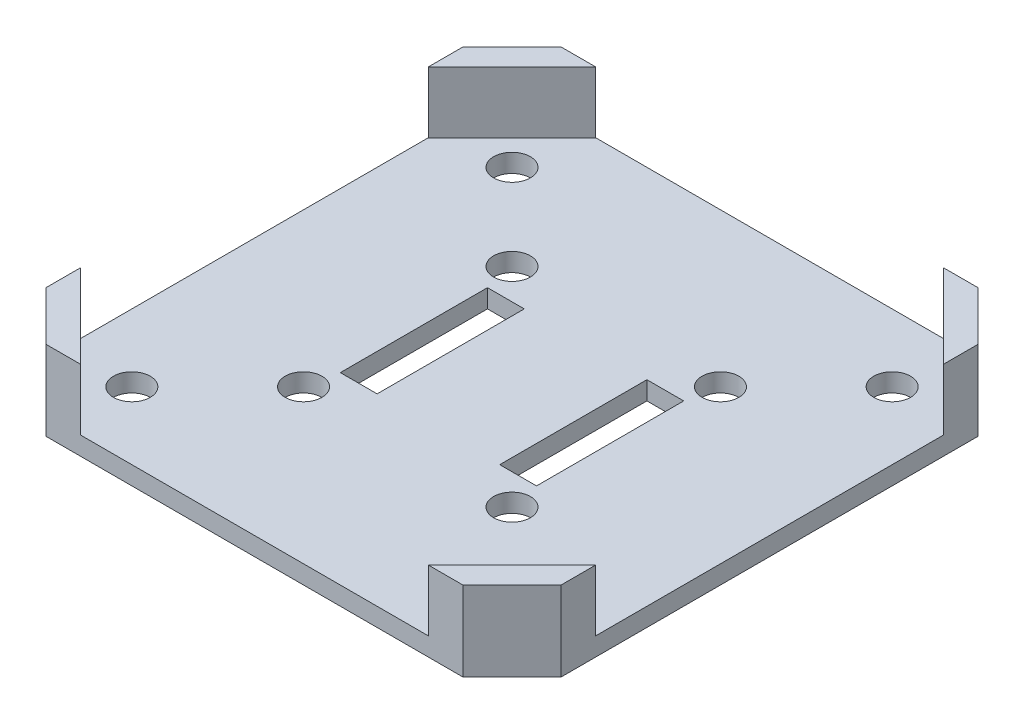
ISO-10303-21;
HEADER;
FILE_DESCRIPTION(('STEP AP214'),'2;1');
FILE_NAME('part.step','',(''),(''),'','','');
FILE_SCHEMA(('AUTOMOTIVE_DESIGN { 1 0 10303 214 1 1 1 1 }'));
ENDSEC;
DATA;
#1=APPLICATION_CONTEXT('core data for automotive mechanical design processes');
#2=APPLICATION_PROTOCOL_DEFINITION('international standard','automotive_design',2000,#1);
#3=PRODUCT_CONTEXT('',#1,'mechanical');
#4=PRODUCT('Part','Part','',(#3));
#5=PRODUCT_RELATED_PRODUCT_CATEGORY('part','',(#4));
#6=PRODUCT_DEFINITION_FORMATION('','',#4);
#7=PRODUCT_DEFINITION_CONTEXT('part definition',#1,'design');
#8=PRODUCT_DEFINITION('design','',#6,#7);
#9=PRODUCT_DEFINITION_SHAPE('','',#8);
#10=(LENGTH_UNIT() NAMED_UNIT(*) SI_UNIT(.MILLI.,.METRE.));
#11=(NAMED_UNIT(*) PLANE_ANGLE_UNIT() SI_UNIT($,.RADIAN.));
#12=(NAMED_UNIT(*) SI_UNIT($,.STERADIAN.) SOLID_ANGLE_UNIT());
#13=UNCERTAINTY_MEASURE_WITH_UNIT(LENGTH_MEASURE(1.E-05),#10,'distance_accuracy_value','');
#14=(GEOMETRIC_REPRESENTATION_CONTEXT(3) GLOBAL_UNCERTAINTY_ASSIGNED_CONTEXT((#13)) GLOBAL_UNIT_ASSIGNED_CONTEXT((#10,
#11,#12)) REPRESENTATION_CONTEXT('',''));
#15=CARTESIAN_POINT('',(0.,0.,0.));
#16=DIRECTION('',(0.,0.,1.));
#17=DIRECTION('',(1.,0.,0.));
#18=AXIS2_PLACEMENT_3D('',#15,#16,#17);
#19=CARTESIAN_POINT('',(0.,1.5,0.));
#20=DIRECTION('',(0.,-1.,0.));
#21=DIRECTION('',(0.,0.,-1.));
#22=AXIS2_PLACEMENT_3D('',#19,#20,#21);
#23=PLANE('',#22);
#24=DIRECTION('',(1.,0.,0.));
#25=VECTOR('',#24,1.);
#26=CARTESIAN_POINT('',(0.,1.5,-6.));
#27=LINE('',#26,#25);
#28=CARTESIAN_POINT('',(-8.,1.5,-6.));
#29=VERTEX_POINT('',#28);
#30=CARTESIAN_POINT('',(-5.,1.5,-6.));
#31=VERTEX_POINT('',#30);
#32=EDGE_CURVE('E338',#29,#31,#27,.T.);
#33=ORIENTED_EDGE('',*,*,#32,.T.);
#34=DIRECTION('',(0.,0.,1.));
#35=VECTOR('',#34,1.);
#36=CARTESIAN_POINT('',(-5.,1.5,0.));
#37=LINE('',#36,#35);
#38=CARTESIAN_POINT('',(-5.,1.5,6.));
#39=VERTEX_POINT('',#38);
#40=EDGE_CURVE('E341',#31,#39,#37,.T.);
#41=ORIENTED_EDGE('',*,*,#40,.T.);
#42=DIRECTION('',(-1.,0.,0.));
#43=VECTOR('',#42,1.);
#44=CARTESIAN_POINT('',(0.,1.5,6.));
#45=LINE('',#44,#43);
#46=CARTESIAN_POINT('',(-8.,1.5,6.));
#47=VERTEX_POINT('',#46);
#48=EDGE_CURVE('E332',#39,#47,#45,.T.);
#49=ORIENTED_EDGE('',*,*,#48,.T.);
#50=DIRECTION('',(0.,0.,-1.));
#51=VECTOR('',#50,1.);
#52=CARTESIAN_POINT('',(-8.,1.5,0.));
#53=LINE('',#52,#51);
#54=EDGE_CURVE('E335',#47,#29,#53,.T.);
#55=ORIENTED_EDGE('',*,*,#54,.T.);
#56=EDGE_LOOP('',(#33,#41,#49,#55));
#57=FACE_BOUND('',#56,.T.);
#58=DIRECTION('',(-1.,0.,0.));
#59=VECTOR('',#58,1.);
#60=CARTESIAN_POINT('',(0.,1.5,6.));
#61=LINE('',#60,#59);
#62=CARTESIAN_POINT('',(8.,1.5,6.));
#63=VERTEX_POINT('',#62);
#64=CARTESIAN_POINT('',(5.,1.5,6.));
#65=VERTEX_POINT('',#64);
#66=EDGE_CURVE('E326',#63,#65,#61,.T.);
#67=ORIENTED_EDGE('',*,*,#66,.T.);
#68=DIRECTION('',(0.,0.,-1.));
#69=VECTOR('',#68,1.);
#70=CARTESIAN_POINT('',(5.,1.5,0.));
#71=LINE('',#70,#69);
#72=CARTESIAN_POINT('',(5.,1.5,-6.));
#73=VERTEX_POINT('',#72);
#74=EDGE_CURVE('E329',#65,#73,#71,.T.);
#75=ORIENTED_EDGE('',*,*,#74,.T.);
#76=DIRECTION('',(1.,0.,0.));
#77=VECTOR('',#76,1.);
#78=CARTESIAN_POINT('',(0.,1.5,-6.));
#79=LINE('',#78,#77);
#80=CARTESIAN_POINT('',(8.,1.5,-6.));
#81=VERTEX_POINT('',#80);
#82=EDGE_CURVE('E296',#73,#81,#79,.T.);
#83=ORIENTED_EDGE('',*,*,#82,.T.);
#84=DIRECTION('',(0.,0.,1.));
#85=VECTOR('',#84,1.);
#86=CARTESIAN_POINT('',(8.,1.5,0.));
#87=LINE('',#86,#85);
#88=EDGE_CURVE('E323',#81,#63,#87,.T.);
#89=ORIENTED_EDGE('',*,*,#88,.T.);
#90=EDGE_LOOP('',(#67,#75,#83,#89));
#91=FACE_BOUND('',#90,.T.);
#92=CARTESIAN_POINT('',(-15.5,1.5,-15.5));
#93=DIRECTION('',(0.,1.,0.));
#94=DIRECTION('',(0.,0.,1.));
#95=AXIS2_PLACEMENT_3D('',#92,#93,#94);
#96=CIRCLE('',#95,1.5);
#97=CARTESIAN_POINT('',(-15.5,1.5,-14.));
#98=VERTEX_POINT('',#97);
#99=EDGE_CURVE('E387',#98,#98,#96,.T.);
#100=ORIENTED_EDGE('',*,*,#99,.F.);
#101=EDGE_LOOP('',(#100));
#102=FACE_BOUND('',#101,.T.);
#103=CARTESIAN_POINT('',(15.5,1.5,-15.5));
#104=DIRECTION('',(0.,1.,0.));
#105=DIRECTION('',(0.,0.,1.));
#106=AXIS2_PLACEMENT_3D('',#103,#104,#105);
#107=CIRCLE('',#106,1.5);
#108=CARTESIAN_POINT('',(15.5,1.5,-14.));
#109=VERTEX_POINT('',#108);
#110=EDGE_CURVE('E381',#109,#109,#107,.T.);
#111=ORIENTED_EDGE('',*,*,#110,.F.);
#112=EDGE_LOOP('',(#111));
#113=FACE_BOUND('',#112,.T.);
#114=CARTESIAN_POINT('',(15.5,1.5,15.5));
#115=DIRECTION('',(0.,1.,0.));
#116=DIRECTION('',(0.,0.,-1.));
#117=AXIS2_PLACEMENT_3D('',#114,#115,#116);
#118=CIRCLE('',#117,1.5);
#119=CARTESIAN_POINT('',(15.5,1.5,14.));
#120=VERTEX_POINT('',#119);
#121=EDGE_CURVE('E375',#120,#120,#118,.T.);
#122=ORIENTED_EDGE('',*,*,#121,.F.);
#123=EDGE_LOOP('',(#122));
#124=FACE_BOUND('',#123,.T.);
#125=CARTESIAN_POINT('',(-15.5,1.5,15.5));
#126=DIRECTION('',(0.,1.,0.));
#127=DIRECTION('',(0.,0.,-1.));
#128=AXIS2_PLACEMENT_3D('',#125,#126,#127);
#129=CIRCLE('',#128,1.5);
#130=CARTESIAN_POINT('',(-15.5,1.5,14.));
#131=VERTEX_POINT('',#130);
#132=EDGE_CURVE('E369',#131,#131,#129,.T.);
#133=ORIENTED_EDGE('',*,*,#132,.F.);
#134=EDGE_LOOP('',(#133));
#135=FACE_BOUND('',#134,.T.);
#136=CARTESIAN_POINT('',(-8.5,1.5,-8.5));
#137=DIRECTION('',(0.,1.,0.));
#138=DIRECTION('',(0.,0.,1.));
#139=AXIS2_PLACEMENT_3D('',#136,#137,#138);
#140=CIRCLE('',#139,1.5);
#141=CARTESIAN_POINT('',(-8.5,1.5,-7.));
#142=VERTEX_POINT('',#141);
#143=EDGE_CURVE('E363',#142,#142,#140,.T.);
#144=ORIENTED_EDGE('',*,*,#143,.F.);
#145=EDGE_LOOP('',(#144));
#146=FACE_BOUND('',#145,.T.);
#147=CARTESIAN_POINT('',(8.5,1.5,-8.5));
#148=DIRECTION('',(0.,1.,0.));
#149=DIRECTION('',(0.,0.,1.));
#150=AXIS2_PLACEMENT_3D('',#147,#148,#149);
#151=CIRCLE('',#150,1.5);
#152=CARTESIAN_POINT('',(8.5,1.5,-7.));
#153=VERTEX_POINT('',#152);
#154=EDGE_CURVE('E357',#153,#153,#151,.T.);
#155=ORIENTED_EDGE('',*,*,#154,.F.);
#156=EDGE_LOOP('',(#155));
#157=FACE_BOUND('',#156,.T.);
#158=CARTESIAN_POINT('',(8.5,1.5,8.5));
#159=DIRECTION('',(0.,1.,0.));
#160=DIRECTION('',(0.,0.,-1.));
#161=AXIS2_PLACEMENT_3D('',#158,#159,#160);
#162=CIRCLE('',#161,1.5);
#163=CARTESIAN_POINT('',(8.5,1.5,7.));
#164=VERTEX_POINT('',#163);
#165=EDGE_CURVE('E351',#164,#164,#162,.T.);
#166=ORIENTED_EDGE('',*,*,#165,.F.);
#167=EDGE_LOOP('',(#166));
#168=FACE_BOUND('',#167,.T.);
#169=CARTESIAN_POINT('',(-8.5,1.5,8.5));
#170=DIRECTION('',(0.,1.,0.));
#171=DIRECTION('',(0.,0.,-1.));
#172=AXIS2_PLACEMENT_3D('',#169,#170,#171);
#173=CIRCLE('',#172,1.5);
#174=CARTESIAN_POINT('',(-8.5,1.5,7.));
#175=VERTEX_POINT('',#174);
#176=EDGE_CURVE('E345',#175,#175,#173,.T.);
#177=ORIENTED_EDGE('',*,*,#176,.F.);
#178=EDGE_LOOP('',(#177));
#179=FACE_BOUND('',#178,.T.);
#180=DIRECTION('',(-0.707106781186548,0.,0.707106781186547));
#181=VECTOR('',#180,1.);
#182=CARTESIAN_POINT('',(17.5857864376269,1.5,17.5857864376269));
#183=LINE('',#182,#181);
#184=CARTESIAN_POINT('',(21.,1.5,14.1715728752538));
#185=VERTEX_POINT('',#184);
#186=CARTESIAN_POINT('',(14.1715728752538,1.5,21.));
#187=VERTEX_POINT('',#186);
#188=EDGE_CURVE('E215',#185,#187,#183,.T.);
#189=ORIENTED_EDGE('',*,*,#188,.F.);
#190=DIRECTION('',(0.,0.,-1.));
#191=VECTOR('',#190,1.);
#192=CARTESIAN_POINT('',(21.,1.5,11.5));
#193=LINE('',#192,#191);
#194=CARTESIAN_POINT('',(21.,1.5,-14.1715728752538));
#195=VERTEX_POINT('',#194);
#196=EDGE_CURVE('E219',#185,#195,#193,.T.);
#197=ORIENTED_EDGE('',*,*,#196,.T.);
#198=DIRECTION('',(-0.707106781186548,0.,-0.707106781186547));
#199=VECTOR('',#198,1.);
#200=CARTESIAN_POINT('',(17.5857864376269,1.5,-17.5857864376269));
#201=LINE('',#200,#199);
#202=CARTESIAN_POINT('',(14.1715728752538,1.5,-21.));
#203=VERTEX_POINT('',#202);
#204=EDGE_CURVE('E262',#195,#203,#201,.T.);
#205=ORIENTED_EDGE('',*,*,#204,.T.);
#206=DIRECTION('',(-1.,0.,0.));
#207=VECTOR('',#206,1.);
#208=CARTESIAN_POINT('',(-17.,1.5,-21.));
#209=LINE('',#208,#207);
#210=CARTESIAN_POINT('',(-14.1715728752538,1.5,-21.));
#211=VERTEX_POINT('',#210);
#212=EDGE_CURVE('E398',#203,#211,#209,.T.);
#213=ORIENTED_EDGE('',*,*,#212,.T.);
#214=DIRECTION('',(0.707106781186548,0.,-0.707106781186547));
#215=VECTOR('',#214,1.);
#216=CARTESIAN_POINT('',(-17.5857864376269,1.5,-17.5857864376269));
#217=LINE('',#216,#215);
#218=CARTESIAN_POINT('',(-21.,1.5,-14.1715728752538));
#219=VERTEX_POINT('',#218);
#220=EDGE_CURVE('E242',#219,#211,#217,.T.);
#221=ORIENTED_EDGE('',*,*,#220,.F.);
#222=DIRECTION('',(0.,0.,1.));
#223=VECTOR('',#222,1.);
#224=CARTESIAN_POINT('',(-21.,1.5,11.5));
#225=LINE('',#224,#223);
#226=CARTESIAN_POINT('',(-21.,1.5,14.1715728752538));
#227=VERTEX_POINT('',#226);
#228=EDGE_CURVE('E393',#219,#227,#225,.T.);
#229=ORIENTED_EDGE('',*,*,#228,.T.);
#230=DIRECTION('',(0.707106781186548,0.,0.707106781186547));
#231=VECTOR('',#230,1.);
#232=CARTESIAN_POINT('',(-17.5857864376269,1.5,17.5857864376269));
#233=LINE('',#232,#231);
#234=CARTESIAN_POINT('',(-14.1715728752538,1.5,21.));
#235=VERTEX_POINT('',#234);
#236=EDGE_CURVE('E55',#227,#235,#233,.T.);
#237=ORIENTED_EDGE('',*,*,#236,.T.);
#238=DIRECTION('',(1.,0.,0.));
#239=VECTOR('',#238,1.);
#240=CARTESIAN_POINT('',(17.,1.5,21.));
#241=LINE('',#240,#239);
#242=EDGE_CURVE('E50',#235,#187,#241,.T.);
#243=ORIENTED_EDGE('',*,*,#242,.T.);
#244=EDGE_LOOP('',(#189,#197,#205,#213,#221,#229,#237,#243));
#245=FACE_BOUND('',#244,.T.);
#246=ADVANCED_FACE('F35',(#57,#91,#102,#113,#124,#135,#146,#157,#168,#179,#245),#23,.F.);
#247=CARTESIAN_POINT('',(0.,0.,0.));
#248=DIRECTION('',(0.,-1.,0.));
#249=DIRECTION('',(0.,0.,-1.));
#250=AXIS2_PLACEMENT_3D('',#247,#248,#249);
#251=PLANE('',#250);
#252=DIRECTION('',(0.,0.,1.));
#253=VECTOR('',#252,1.);
#254=CARTESIAN_POINT('',(-5.,0.,-6.));
#255=LINE('',#254,#253);
#256=CARTESIAN_POINT('',(-5.,0.,-6.));
#257=VERTEX_POINT('',#256);
#258=CARTESIAN_POINT('',(-5.,0.,6.));
#259=VERTEX_POINT('',#258);
#260=EDGE_CURVE('E281',#257,#259,#255,.T.);
#261=ORIENTED_EDGE('',*,*,#260,.F.);
#262=DIRECTION('',(1.,0.,0.));
#263=VECTOR('',#262,1.);
#264=CARTESIAN_POINT('',(-5.,0.,-6.));
#265=LINE('',#264,#263);
#266=CARTESIAN_POINT('',(-8.,0.,-6.));
#267=VERTEX_POINT('',#266);
#268=EDGE_CURVE('E290',#267,#257,#265,.T.);
#269=ORIENTED_EDGE('',*,*,#268,.F.);
#270=DIRECTION('',(0.,0.,-1.));
#271=VECTOR('',#270,1.);
#272=CARTESIAN_POINT('',(-8.,0.,-6.));
#273=LINE('',#272,#271);
#274=CARTESIAN_POINT('',(-8.,0.,6.));
#275=VERTEX_POINT('',#274);
#276=EDGE_CURVE('E287',#275,#267,#273,.T.);
#277=ORIENTED_EDGE('',*,*,#276,.F.);
#278=DIRECTION('',(-1.,0.,0.));
#279=VECTOR('',#278,1.);
#280=CARTESIAN_POINT('',(-5.,0.,6.));
#281=LINE('',#280,#279);
#282=EDGE_CURVE('E283',#259,#275,#281,.T.);
#283=ORIENTED_EDGE('',*,*,#282,.F.);
#284=EDGE_LOOP('',(#261,#269,#277,#283));
#285=FACE_BOUND('',#284,.T.);
#286=DIRECTION('',(0.,0.,-1.));
#287=VECTOR('',#286,1.);
#288=CARTESIAN_POINT('',(5.,0.,-6.));
#289=LINE('',#288,#287);
#290=CARTESIAN_POINT('',(5.,0.,6.));
#291=VERTEX_POINT('',#290);
#292=CARTESIAN_POINT('',(5.,0.,-6.));
#293=VERTEX_POINT('',#292);
#294=EDGE_CURVE('E280',#291,#293,#289,.T.);
#295=ORIENTED_EDGE('',*,*,#294,.F.);
#296=DIRECTION('',(-1.,0.,0.));
#297=VECTOR('',#296,1.);
#298=CARTESIAN_POINT('',(5.,0.,6.));
#299=LINE('',#298,#297);
#300=CARTESIAN_POINT('',(8.,0.,6.));
#301=VERTEX_POINT('',#300);
#302=EDGE_CURVE('E310',#301,#291,#299,.T.);
#303=ORIENTED_EDGE('',*,*,#302,.F.);
#304=DIRECTION('',(0.,0.,1.));
#305=VECTOR('',#304,1.);
#306=CARTESIAN_POINT('',(8.,0.,-6.));
#307=LINE('',#306,#305);
#308=CARTESIAN_POINT('',(8.,0.,-6.));
#309=VERTEX_POINT('',#308);
#310=EDGE_CURVE('E307',#309,#301,#307,.T.);
#311=ORIENTED_EDGE('',*,*,#310,.F.);
#312=DIRECTION('',(1.,0.,0.));
#313=VECTOR('',#312,1.);
#314=CARTESIAN_POINT('',(5.,0.,-6.));
#315=LINE('',#314,#313);
#316=EDGE_CURVE('E304',#293,#309,#315,.T.);
#317=ORIENTED_EDGE('',*,*,#316,.F.);
#318=EDGE_LOOP('',(#295,#303,#311,#317));
#319=FACE_BOUND('',#318,.T.);
#320=CARTESIAN_POINT('',(8.5,0.,8.5));
#321=DIRECTION('',(0.,1.,0.));
#322=DIRECTION('',(0.,0.,-1.));
#323=AXIS2_PLACEMENT_3D('',#320,#321,#322);
#324=CIRCLE('',#323,1.5);
#325=CARTESIAN_POINT('',(8.5,0.,7.));
#326=VERTEX_POINT('',#325);
#327=EDGE_CURVE('E348',#326,#326,#324,.T.);
#328=ORIENTED_EDGE('',*,*,#327,.T.);
#329=EDGE_LOOP('',(#328));
#330=FACE_BOUND('',#329,.T.);
#331=CARTESIAN_POINT('',(-8.5,0.,-8.5));
#332=DIRECTION('',(0.,1.,0.));
#333=DIRECTION('',(0.,0.,1.));
#334=AXIS2_PLACEMENT_3D('',#331,#332,#333);
#335=CIRCLE('',#334,1.5);
#336=CARTESIAN_POINT('',(-8.5,0.,-7.));
#337=VERTEX_POINT('',#336);
#338=EDGE_CURVE('E360',#337,#337,#335,.T.);
#339=ORIENTED_EDGE('',*,*,#338,.T.);
#340=EDGE_LOOP('',(#339));
#341=FACE_BOUND('',#340,.T.);
#342=CARTESIAN_POINT('',(15.5,0.,15.5));
#343=DIRECTION('',(0.,1.,0.));
#344=DIRECTION('',(0.,0.,-1.));
#345=AXIS2_PLACEMENT_3D('',#342,#343,#344);
#346=CIRCLE('',#345,1.5);
#347=CARTESIAN_POINT('',(15.5,0.,14.));
#348=VERTEX_POINT('',#347);
#349=EDGE_CURVE('E372',#348,#348,#346,.T.);
#350=ORIENTED_EDGE('',*,*,#349,.T.);
#351=EDGE_LOOP('',(#350));
#352=FACE_BOUND('',#351,.T.);
#353=CARTESIAN_POINT('',(-15.5,0.,-15.5));
#354=DIRECTION('',(0.,1.,0.));
#355=DIRECTION('',(0.,0.,1.));
#356=AXIS2_PLACEMENT_3D('',#353,#354,#355);
#357=CIRCLE('',#356,1.5);
#358=CARTESIAN_POINT('',(-15.5,0.,-14.));
#359=VERTEX_POINT('',#358);
#360=EDGE_CURVE('E384',#359,#359,#357,.T.);
#361=ORIENTED_EDGE('',*,*,#360,.T.);
#362=EDGE_LOOP('',(#361));
#363=FACE_BOUND('',#362,.T.);
#364=DIRECTION('',(0.707106781186548,0.,0.707106781186548));
#365=VECTOR('',#364,1.);
#366=CARTESIAN_POINT('',(-17.,0.,21.));
#367=LINE('',#366,#365);
#368=CARTESIAN_POINT('',(-21.,0.,17.));
#369=VERTEX_POINT('',#368);
#370=CARTESIAN_POINT('',(-17.,0.,21.));
#371=VERTEX_POINT('',#370);
#372=EDGE_CURVE('E390',#369,#371,#367,.T.);
#373=ORIENTED_EDGE('',*,*,#372,.F.);
#374=DIRECTION('',(0.,0.,1.));
#375=VECTOR('',#374,1.);
#376=CARTESIAN_POINT('',(-21.,0.,-11.5));
#377=LINE('',#376,#375);
#378=CARTESIAN_POINT('',(-21.,0.,-17.));
#379=VERTEX_POINT('',#378);
#380=EDGE_CURVE('E395',#379,#369,#377,.T.);
#381=ORIENTED_EDGE('',*,*,#380,.F.);
#382=DIRECTION('',(-0.707106781186546,0.,0.707106781186549));
#383=VECTOR('',#382,1.);
#384=CARTESIAN_POINT('',(-21.,0.,-17.));
#385=LINE('',#384,#383);
#386=CARTESIAN_POINT('',(-17.,0.,-21.));
#387=VERTEX_POINT('',#386);
#388=EDGE_CURVE('E413',#387,#379,#385,.T.);
#389=ORIENTED_EDGE('',*,*,#388,.F.);
#390=DIRECTION('',(-1.,0.,0.));
#391=VECTOR('',#390,1.);
#392=CARTESIAN_POINT('',(-17.,0.,-21.));
#393=LINE('',#392,#391);
#394=CARTESIAN_POINT('',(17.,0.,-21.));
#395=VERTEX_POINT('',#394);
#396=EDGE_CURVE('E411',#395,#387,#393,.T.);
#397=ORIENTED_EDGE('',*,*,#396,.F.);
#398=DIRECTION('',(-0.70710678118655,0.,-0.707106781186545));
#399=VECTOR('',#398,1.);
#400=CARTESIAN_POINT('',(17.,0.,-21.));
#401=LINE('',#400,#399);
#402=CARTESIAN_POINT('',(21.,0.,-17.));
#403=VERTEX_POINT('',#402);
#404=EDGE_CURVE('E409',#403,#395,#401,.T.);
#405=ORIENTED_EDGE('',*,*,#404,.F.);
#406=DIRECTION('',(0.,0.,-1.));
#407=VECTOR('',#406,1.);
#408=CARTESIAN_POINT('',(21.,0.,-17.));
#409=LINE('',#408,#407);
#410=CARTESIAN_POINT('',(21.,0.,17.));
#411=VERTEX_POINT('',#410);
#412=EDGE_CURVE('E407',#411,#403,#409,.T.);
#413=ORIENTED_EDGE('',*,*,#412,.F.);
#414=DIRECTION('',(0.707106781186546,0.,-0.707106781186549));
#415=VECTOR('',#414,1.);
#416=CARTESIAN_POINT('',(17.,0.,21.));
#417=LINE('',#416,#415);
#418=CARTESIAN_POINT('',(17.,0.,21.));
#419=VERTEX_POINT('',#418);
#420=EDGE_CURVE('E404',#419,#411,#417,.T.);
#421=ORIENTED_EDGE('',*,*,#420,.F.);
#422=DIRECTION('',(1.,0.,0.));
#423=VECTOR('',#422,1.);
#424=CARTESIAN_POINT('',(17.,0.,21.));
#425=LINE('',#424,#423);
#426=EDGE_CURVE('E402',#371,#419,#425,.T.);
#427=ORIENTED_EDGE('',*,*,#426,.F.);
#428=EDGE_LOOP('',(#373,#381,#389,#397,#405,#413,#421,#427));
#429=FACE_BOUND('',#428,.T.);
#430=CARTESIAN_POINT('',(15.5,0.,-15.5));
#431=DIRECTION('',(0.,1.,0.));
#432=DIRECTION('',(0.,0.,1.));
#433=AXIS2_PLACEMENT_3D('',#430,#431,#432);
#434=CIRCLE('',#433,1.5);
#435=CARTESIAN_POINT('',(15.5,0.,-14.));
#436=VERTEX_POINT('',#435);
#437=EDGE_CURVE('E378',#436,#436,#434,.T.);
#438=ORIENTED_EDGE('',*,*,#437,.T.);
#439=EDGE_LOOP('',(#438));
#440=FACE_BOUND('',#439,.T.);
#441=CARTESIAN_POINT('',(-15.5,0.,15.5));
#442=DIRECTION('',(0.,1.,0.));
#443=DIRECTION('',(0.,0.,-1.));
#444=AXIS2_PLACEMENT_3D('',#441,#442,#443);
#445=CIRCLE('',#444,1.5);
#446=CARTESIAN_POINT('',(-15.5,0.,14.));
#447=VERTEX_POINT('',#446);
#448=EDGE_CURVE('E366',#447,#447,#445,.T.);
#449=ORIENTED_EDGE('',*,*,#448,.T.);
#450=EDGE_LOOP('',(#449));
#451=FACE_BOUND('',#450,.T.);
#452=CARTESIAN_POINT('',(8.5,0.,-8.5));
#453=DIRECTION('',(0.,1.,0.));
#454=DIRECTION('',(0.,0.,1.));
#455=AXIS2_PLACEMENT_3D('',#452,#453,#454);
#456=CIRCLE('',#455,1.5);
#457=CARTESIAN_POINT('',(8.5,0.,-7.));
#458=VERTEX_POINT('',#457);
#459=EDGE_CURVE('E354',#458,#458,#456,.T.);
#460=ORIENTED_EDGE('',*,*,#459,.T.);
#461=EDGE_LOOP('',(#460));
#462=FACE_BOUND('',#461,.T.);
#463=CARTESIAN_POINT('',(-8.5,0.,8.5));
#464=DIRECTION('',(0.,1.,0.));
#465=DIRECTION('',(0.,0.,-1.));
#466=AXIS2_PLACEMENT_3D('',#463,#464,#465);
#467=CIRCLE('',#466,1.5);
#468=CARTESIAN_POINT('',(-8.5,0.,7.));
#469=VERTEX_POINT('',#468);
#470=EDGE_CURVE('E344',#469,#469,#467,.T.);
#471=ORIENTED_EDGE('',*,*,#470,.T.);
#472=EDGE_LOOP('',(#471));
#473=FACE_BOUND('',#472,.T.);
#474=ADVANCED_FACE('F442',(#285,#319,#330,#341,#352,#363,#429,#440,#451,#462,#473),#251,.T.);
#475=CARTESIAN_POINT('',(-17.,1.5,21.));
#476=DIRECTION('',(0.707106781186547,0.,-0.707106781186547));
#477=DIRECTION('',(-0.707106781186548,0.,-0.707106781186548));
#478=AXIS2_PLACEMENT_3D('',#475,#476,#477);
#479=PLANE('',#478);
#480=ORIENTED_EDGE('',*,*,#372,.T.);
#481=DIRECTION('',(0.,-1.,0.));
#482=VECTOR('',#481,1.);
#483=CARTESIAN_POINT('',(-17.,1.5,21.));
#484=LINE('',#483,#482);
#485=CARTESIAN_POINT('',(-17.,6.5,21.));
#486=VERTEX_POINT('',#485);
#487=EDGE_CURVE('E43',#486,#371,#484,.T.);
#488=ORIENTED_EDGE('',*,*,#487,.F.);
#489=DIRECTION('',(0.707106781186548,0.,0.707106781186548));
#490=VECTOR('',#489,1.);
#491=CARTESIAN_POINT('',(-19.,6.5,19.));
#492=LINE('',#491,#490);
#493=CARTESIAN_POINT('',(-21.,6.5,17.));
#494=VERTEX_POINT('',#493);
#495=EDGE_CURVE('E231',#494,#486,#492,.T.);
#496=ORIENTED_EDGE('',*,*,#495,.F.);
#497=DIRECTION('',(0.,-1.,0.));
#498=VECTOR('',#497,1.);
#499=CARTESIAN_POINT('',(-21.,1.5,17.));
#500=LINE('',#499,#498);
#501=EDGE_CURVE('E11',#494,#369,#500,.T.);
#502=ORIENTED_EDGE('',*,*,#501,.T.);
#503=EDGE_LOOP('',(#480,#488,#496,#502));
#504=FACE_BOUND('',#503,.T.);
#505=ADVANCED_FACE('F37',(#504),#479,.F.);
#506=CARTESIAN_POINT('',(17.,1.5,21.));
#507=DIRECTION('',(0.,0.,-1.));
#508=DIRECTION('',(-1.,0.,0.));
#509=AXIS2_PLACEMENT_3D('',#506,#507,#508);
#510=PLANE('',#509);
#511=ORIENTED_EDGE('',*,*,#426,.T.);
#512=DIRECTION('',(0.,-1.,0.));
#513=VECTOR('',#512,1.);
#514=CARTESIAN_POINT('',(17.,1.5,21.));
#515=LINE('',#514,#513);
#516=CARTESIAN_POINT('',(17.,6.5,21.));
#517=VERTEX_POINT('',#516);
#518=EDGE_CURVE('E429',#517,#419,#515,.T.);
#519=ORIENTED_EDGE('',*,*,#518,.F.);
#520=DIRECTION('',(1.,0.,0.));
#521=VECTOR('',#520,1.);
#522=CARTESIAN_POINT('',(0.,6.5,21.));
#523=LINE('',#522,#521);
#524=CARTESIAN_POINT('',(14.1715728752538,6.5,21.));
#525=VERTEX_POINT('',#524);
#526=EDGE_CURVE('E205',#525,#517,#523,.T.);
#527=ORIENTED_EDGE('',*,*,#526,.F.);
#528=DIRECTION('',(0.,-1.,0.));
#529=VECTOR('',#528,1.);
#530=CARTESIAN_POINT('',(14.1715728752538,6.5,21.));
#531=LINE('',#530,#529);
#532=EDGE_CURVE('E201',#525,#187,#531,.T.);
#533=ORIENTED_EDGE('',*,*,#532,.T.);
#534=ORIENTED_EDGE('',*,*,#242,.F.);
#535=DIRECTION('',(0.,-1.,0.));
#536=VECTOR('',#535,1.);
#537=CARTESIAN_POINT('',(-14.1715728752538,6.5,21.));
#538=LINE('',#537,#536);
#539=CARTESIAN_POINT('',(-14.1715728752538,6.5,21.));
#540=VERTEX_POINT('',#539);
#541=EDGE_CURVE('E235',#540,#235,#538,.T.);
#542=ORIENTED_EDGE('',*,*,#541,.F.);
#543=DIRECTION('',(1.,0.,0.));
#544=VECTOR('',#543,1.);
#545=CARTESIAN_POINT('',(0.,6.5,21.));
#546=LINE('',#545,#544);
#547=EDGE_CURVE('E234',#486,#540,#546,.T.);
#548=ORIENTED_EDGE('',*,*,#547,.F.);
#549=ORIENTED_EDGE('',*,*,#487,.T.);
#550=EDGE_LOOP('',(#511,#519,#527,#533,#534,#542,#548,#549));
#551=FACE_BOUND('',#550,.T.);
#552=ADVANCED_FACE('F435',(#551),#510,.F.);
#553=CARTESIAN_POINT('',(17.,1.5,21.));
#554=DIRECTION('',(-0.707106781186549,0.,-0.707106781186546));
#555=DIRECTION('',(-0.707106781186546,0.,0.707106781186549));
#556=AXIS2_PLACEMENT_3D('',#553,#554,#555);
#557=PLANE('',#556);
#558=ORIENTED_EDGE('',*,*,#420,.T.);
#559=DIRECTION('',(0.,-1.,0.));
#560=VECTOR('',#559,1.);
#561=CARTESIAN_POINT('',(21.,1.5,17.));
#562=LINE('',#561,#560);
#563=CARTESIAN_POINT('',(21.,6.5,17.));
#564=VERTEX_POINT('',#563);
#565=EDGE_CURVE('E427',#564,#411,#562,.T.);
#566=ORIENTED_EDGE('',*,*,#565,.F.);
#567=DIRECTION('',(0.707106781186546,0.,-0.707106781186549));
#568=VECTOR('',#567,1.);
#569=CARTESIAN_POINT('',(19.,6.5,19.));
#570=LINE('',#569,#568);
#571=EDGE_CURVE('E212',#517,#564,#570,.T.);
#572=ORIENTED_EDGE('',*,*,#571,.F.);
#573=ORIENTED_EDGE('',*,*,#518,.T.);
#574=EDGE_LOOP('',(#558,#566,#572,#573));
#575=FACE_BOUND('',#574,.T.);
#576=ADVANCED_FACE('F447',(#575),#557,.F.);
#577=CARTESIAN_POINT('',(21.,1.5,-17.));
#578=DIRECTION('',(-1.,0.,0.));
#579=DIRECTION('',(0.,0.,1.));
#580=AXIS2_PLACEMENT_3D('',#577,#578,#579);
#581=PLANE('',#580);
#582=ORIENTED_EDGE('',*,*,#412,.T.);
#583=DIRECTION('',(0.,-1.,0.));
#584=VECTOR('',#583,1.);
#585=CARTESIAN_POINT('',(21.,1.5,-17.));
#586=LINE('',#585,#584);
#587=CARTESIAN_POINT('',(21.,6.5,-17.));
#588=VERTEX_POINT('',#587);
#589=EDGE_CURVE('E424',#588,#403,#586,.T.);
#590=ORIENTED_EDGE('',*,*,#589,.F.);
#591=DIRECTION('',(0.,0.,-1.));
#592=VECTOR('',#591,1.);
#593=CARTESIAN_POINT('',(21.,6.5,0.));
#594=LINE('',#593,#592);
#595=CARTESIAN_POINT('',(21.,6.5,-14.1715728752538));
#596=VERTEX_POINT('',#595);
#597=EDGE_CURVE('E266',#596,#588,#594,.T.);
#598=ORIENTED_EDGE('',*,*,#597,.F.);
#599=DIRECTION('',(0.,-1.,0.));
#600=VECTOR('',#599,1.);
#601=CARTESIAN_POINT('',(21.,6.5,-14.1715728752538));
#602=LINE('',#601,#600);
#603=EDGE_CURVE('E278',#596,#195,#602,.T.);
#604=ORIENTED_EDGE('',*,*,#603,.T.);
#605=ORIENTED_EDGE('',*,*,#196,.F.);
#606=DIRECTION('',(0.,-1.,0.));
#607=VECTOR('',#606,1.);
#608=CARTESIAN_POINT('',(21.,6.5,14.1715728752538));
#609=LINE('',#608,#607);
#610=CARTESIAN_POINT('',(21.,6.5,14.1715728752538));
#611=VERTEX_POINT('',#610);
#612=EDGE_CURVE('E199',#611,#185,#609,.T.);
#613=ORIENTED_EDGE('',*,*,#612,.F.);
#614=DIRECTION('',(0.,0.,-1.));
#615=VECTOR('',#614,1.);
#616=CARTESIAN_POINT('',(21.,6.5,0.));
#617=LINE('',#616,#615);
#618=EDGE_CURVE('E206',#564,#611,#617,.T.);
#619=ORIENTED_EDGE('',*,*,#618,.F.);
#620=ORIENTED_EDGE('',*,*,#565,.T.);
#621=EDGE_LOOP('',(#582,#590,#598,#604,#605,#613,#619,#620));
#622=FACE_BOUND('',#621,.T.);
#623=ADVANCED_FACE('F217',(#622),#581,.F.);
#624=CARTESIAN_POINT('',(17.,1.5,-21.));
#625=DIRECTION('',(-0.707106781186545,0.,0.70710678118655));
#626=DIRECTION('',(0.70710678118655,0.,0.707106781186545));
#627=AXIS2_PLACEMENT_3D('',#624,#625,#626);
#628=PLANE('',#627);
#629=ORIENTED_EDGE('',*,*,#404,.T.);
#630=DIRECTION('',(0.,-1.,0.));
#631=VECTOR('',#630,1.);
#632=CARTESIAN_POINT('',(17.,1.5,-21.));
#633=LINE('',#632,#631);
#634=CARTESIAN_POINT('',(17.,6.5,-21.));
#635=VERTEX_POINT('',#634);
#636=EDGE_CURVE('E421',#635,#395,#633,.T.);
#637=ORIENTED_EDGE('',*,*,#636,.F.);
#638=DIRECTION('',(-0.70710678118655,0.,-0.707106781186545));
#639=VECTOR('',#638,1.);
#640=CARTESIAN_POINT('',(18.9999999999999,6.5,-19.));
#641=LINE('',#640,#639);
#642=EDGE_CURVE('E269',#588,#635,#641,.T.);
#643=ORIENTED_EDGE('',*,*,#642,.F.);
#644=ORIENTED_EDGE('',*,*,#589,.T.);
#645=EDGE_LOOP('',(#629,#637,#643,#644));
#646=FACE_BOUND('',#645,.T.);
#647=ADVANCED_FACE('F451',(#646),#628,.F.);
#648=CARTESIAN_POINT('',(-17.,1.5,-21.));
#649=DIRECTION('',(0.,0.,1.));
#650=DIRECTION('',(1.,0.,0.));
#651=AXIS2_PLACEMENT_3D('',#648,#649,#650);
#652=PLANE('',#651);
#653=ORIENTED_EDGE('',*,*,#396,.T.);
#654=DIRECTION('',(0.,-1.,0.));
#655=VECTOR('',#654,1.);
#656=CARTESIAN_POINT('',(-17.,1.5,-21.));
#657=LINE('',#656,#655);
#658=CARTESIAN_POINT('',(-17.,6.5,-21.));
#659=VERTEX_POINT('',#658);
#660=EDGE_CURVE('E418',#659,#387,#657,.T.);
#661=ORIENTED_EDGE('',*,*,#660,.F.);
#662=DIRECTION('',(-1.,0.,0.));
#663=VECTOR('',#662,1.);
#664=CARTESIAN_POINT('',(0.,6.5,-21.));
#665=LINE('',#664,#663);
#666=CARTESIAN_POINT('',(-14.1715728752538,6.5,-21.));
#667=VERTEX_POINT('',#666);
#668=EDGE_CURVE('E248',#667,#659,#665,.T.);
#669=ORIENTED_EDGE('',*,*,#668,.F.);
#670=DIRECTION('',(0.,-1.,0.));
#671=VECTOR('',#670,1.);
#672=CARTESIAN_POINT('',(-14.1715728752538,6.5,-21.));
#673=LINE('',#672,#671);
#674=EDGE_CURVE('E254',#667,#211,#673,.T.);
#675=ORIENTED_EDGE('',*,*,#674,.T.);
#676=ORIENTED_EDGE('',*,*,#212,.F.);
#677=DIRECTION('',(0.,-1.,0.));
#678=VECTOR('',#677,1.);
#679=CARTESIAN_POINT('',(14.1715728752538,6.5,-21.));
#680=LINE('',#679,#678);
#681=CARTESIAN_POINT('',(14.1715728752538,6.5,-21.));
#682=VERTEX_POINT('',#681);
#683=EDGE_CURVE('E274',#682,#203,#680,.T.);
#684=ORIENTED_EDGE('',*,*,#683,.F.);
#685=DIRECTION('',(-1.,0.,0.));
#686=VECTOR('',#685,1.);
#687=CARTESIAN_POINT('',(0.,6.5,-21.));
#688=LINE('',#687,#686);
#689=EDGE_CURVE('E272',#635,#682,#688,.T.);
#690=ORIENTED_EDGE('',*,*,#689,.F.);
#691=ORIENTED_EDGE('',*,*,#636,.T.);
#692=EDGE_LOOP('',(#653,#661,#669,#675,#676,#684,#690,#691));
#693=FACE_BOUND('',#692,.T.);
#694=ADVANCED_FACE('F455',(#693),#652,.F.);
#695=CARTESIAN_POINT('',(-21.,1.5,-17.));
#696=DIRECTION('',(0.707106781186549,0.,0.707106781186546));
#697=DIRECTION('',(0.707106781186546,0.,-0.707106781186549));
#698=AXIS2_PLACEMENT_3D('',#695,#696,#697);
#699=PLANE('',#698);
#700=ORIENTED_EDGE('',*,*,#388,.T.);
#701=DIRECTION('',(0.,-1.,0.));
#702=VECTOR('',#701,1.);
#703=CARTESIAN_POINT('',(-21.,1.5,-17.));
#704=LINE('',#703,#702);
#705=CARTESIAN_POINT('',(-21.,6.5,-17.));
#706=VERTEX_POINT('',#705);
#707=EDGE_CURVE('E400',#706,#379,#704,.T.);
#708=ORIENTED_EDGE('',*,*,#707,.F.);
#709=DIRECTION('',(-0.707106781186546,0.,0.707106781186549));
#710=VECTOR('',#709,1.);
#711=CARTESIAN_POINT('',(-19.,6.5,-19.));
#712=LINE('',#711,#710);
#713=EDGE_CURVE('E251',#659,#706,#712,.T.);
#714=ORIENTED_EDGE('',*,*,#713,.F.);
#715=ORIENTED_EDGE('',*,*,#660,.T.);
#716=EDGE_LOOP('',(#700,#708,#714,#715));
#717=FACE_BOUND('',#716,.T.);
#718=ADVANCED_FACE('F460',(#717),#699,.F.);
#719=CARTESIAN_POINT('',(-21.,1.5,-11.5));
#720=DIRECTION('',(1.,0.,0.));
#721=DIRECTION('',(0.,0.,-1.));
#722=AXIS2_PLACEMENT_3D('',#719,#720,#721);
#723=PLANE('',#722);
#724=ORIENTED_EDGE('',*,*,#380,.T.);
#725=ORIENTED_EDGE('',*,*,#501,.F.);
#726=DIRECTION('',(0.,0.,1.));
#727=VECTOR('',#726,1.);
#728=CARTESIAN_POINT('',(-21.,6.5,0.));
#729=LINE('',#728,#727);
#730=CARTESIAN_POINT('',(-21.,6.5,14.1715728752538));
#731=VERTEX_POINT('',#730);
#732=EDGE_CURVE('E228',#731,#494,#729,.T.);
#733=ORIENTED_EDGE('',*,*,#732,.F.);
#734=DIRECTION('',(0.,-1.,0.));
#735=VECTOR('',#734,1.);
#736=CARTESIAN_POINT('',(-21.,6.5,14.1715728752538));
#737=LINE('',#736,#735);
#738=EDGE_CURVE('E239',#731,#227,#737,.T.);
#739=ORIENTED_EDGE('',*,*,#738,.T.);
#740=ORIENTED_EDGE('',*,*,#228,.F.);
#741=DIRECTION('',(0.,-1.,0.));
#742=VECTOR('',#741,1.);
#743=CARTESIAN_POINT('',(-21.,6.5,-14.1715728752538));
#744=LINE('',#743,#742);
#745=CARTESIAN_POINT('',(-21.,6.5,-14.1715728752538));
#746=VERTEX_POINT('',#745);
#747=EDGE_CURVE('E259',#746,#219,#744,.T.);
#748=ORIENTED_EDGE('',*,*,#747,.F.);
#749=DIRECTION('',(0.,0.,1.));
#750=VECTOR('',#749,1.);
#751=CARTESIAN_POINT('',(-21.,6.5,0.));
#752=LINE('',#751,#750);
#753=EDGE_CURVE('E243',#706,#746,#752,.T.);
#754=ORIENTED_EDGE('',*,*,#753,.F.);
#755=ORIENTED_EDGE('',*,*,#707,.T.);
#756=EDGE_LOOP('',(#724,#725,#733,#739,#740,#748,#754,#755));
#757=FACE_BOUND('',#756,.T.);
#758=ADVANCED_FACE('F466',(#757),#723,.F.);
#759=CARTESIAN_POINT('',(-15.5,1.5,-15.5));
#760=DIRECTION('',(0.,-1.,0.));
#761=DIRECTION('',(0.,0.,-1.));
#762=AXIS2_PLACEMENT_3D('',#759,#760,#761);
#763=CYLINDRICAL_SURFACE('',#762,1.5);
#764=ORIENTED_EDGE('',*,*,#99,.T.);
#765=EDGE_LOOP('',(#764));
#766=FACE_BOUND('',#765,.T.);
#767=ORIENTED_EDGE('',*,*,#360,.F.);
#768=EDGE_LOOP('',(#767));
#769=FACE_BOUND('',#768,.T.);
#770=ADVANCED_FACE('F498',(#766,#769),#763,.F.);
#771=CARTESIAN_POINT('',(15.5,1.5,-15.5));
#772=DIRECTION('',(0.,-1.,0.));
#773=DIRECTION('',(0.,0.,-1.));
#774=AXIS2_PLACEMENT_3D('',#771,#772,#773);
#775=CYLINDRICAL_SURFACE('',#774,1.5);
#776=ORIENTED_EDGE('',*,*,#110,.T.);
#777=EDGE_LOOP('',(#776));
#778=FACE_BOUND('',#777,.T.);
#779=ORIENTED_EDGE('',*,*,#437,.F.);
#780=EDGE_LOOP('',(#779));
#781=FACE_BOUND('',#780,.T.);
#782=ADVANCED_FACE('F789',(#778,#781),#775,.F.);
#783=CARTESIAN_POINT('',(15.5,1.5,15.5));
#784=DIRECTION('',(0.,-1.,0.));
#785=DIRECTION('',(0.,0.,-1.));
#786=AXIS2_PLACEMENT_3D('',#783,#784,#785);
#787=CYLINDRICAL_SURFACE('',#786,1.5);
#788=ORIENTED_EDGE('',*,*,#121,.T.);
#789=EDGE_LOOP('',(#788));
#790=FACE_BOUND('',#789,.T.);
#791=ORIENTED_EDGE('',*,*,#349,.F.);
#792=EDGE_LOOP('',(#791));
#793=FACE_BOUND('',#792,.T.);
#794=ADVANCED_FACE('F779',(#790,#793),#787,.F.);
#795=CARTESIAN_POINT('',(-15.5,1.5,15.5));
#796=DIRECTION('',(0.,-1.,0.));
#797=DIRECTION('',(0.,0.,-1.));
#798=AXIS2_PLACEMENT_3D('',#795,#796,#797);
#799=CYLINDRICAL_SURFACE('',#798,1.5);
#800=ORIENTED_EDGE('',*,*,#132,.T.);
#801=EDGE_LOOP('',(#800));
#802=FACE_BOUND('',#801,.T.);
#803=ORIENTED_EDGE('',*,*,#448,.F.);
#804=EDGE_LOOP('',(#803));
#805=FACE_BOUND('',#804,.T.);
#806=ADVANCED_FACE('F769',(#802,#805),#799,.F.);
#807=CARTESIAN_POINT('',(-8.5,1.5,-8.5));
#808=DIRECTION('',(0.,-1.,0.));
#809=DIRECTION('',(0.,0.,-1.));
#810=AXIS2_PLACEMENT_3D('',#807,#808,#809);
#811=CYLINDRICAL_SURFACE('',#810,1.5);
#812=ORIENTED_EDGE('',*,*,#143,.T.);
#813=EDGE_LOOP('',(#812));
#814=FACE_BOUND('',#813,.T.);
#815=ORIENTED_EDGE('',*,*,#338,.F.);
#816=EDGE_LOOP('',(#815));
#817=FACE_BOUND('',#816,.T.);
#818=ADVANCED_FACE('F759',(#814,#817),#811,.F.);
#819=CARTESIAN_POINT('',(8.5,1.5,-8.5));
#820=DIRECTION('',(0.,-1.,0.));
#821=DIRECTION('',(0.,0.,-1.));
#822=AXIS2_PLACEMENT_3D('',#819,#820,#821);
#823=CYLINDRICAL_SURFACE('',#822,1.5);
#824=ORIENTED_EDGE('',*,*,#154,.T.);
#825=EDGE_LOOP('',(#824));
#826=FACE_BOUND('',#825,.T.);
#827=ORIENTED_EDGE('',*,*,#459,.F.);
#828=EDGE_LOOP('',(#827));
#829=FACE_BOUND('',#828,.T.);
#830=ADVANCED_FACE('F749',(#826,#829),#823,.F.);
#831=CARTESIAN_POINT('',(8.5,1.5,8.5));
#832=DIRECTION('',(0.,-1.,0.));
#833=DIRECTION('',(0.,0.,-1.));
#834=AXIS2_PLACEMENT_3D('',#831,#832,#833);
#835=CYLINDRICAL_SURFACE('',#834,1.5);
#836=ORIENTED_EDGE('',*,*,#165,.T.);
#837=EDGE_LOOP('',(#836));
#838=FACE_BOUND('',#837,.T.);
#839=ORIENTED_EDGE('',*,*,#327,.F.);
#840=EDGE_LOOP('',(#839));
#841=FACE_BOUND('',#840,.T.);
#842=ADVANCED_FACE('F739',(#838,#841),#835,.F.);
#843=CARTESIAN_POINT('',(-8.5,1.5,8.5));
#844=DIRECTION('',(0.,-1.,0.));
#845=DIRECTION('',(0.,0.,-1.));
#846=AXIS2_PLACEMENT_3D('',#843,#844,#845);
#847=CYLINDRICAL_SURFACE('',#846,1.5);
#848=ORIENTED_EDGE('',*,*,#176,.T.);
#849=EDGE_LOOP('',(#848));
#850=FACE_BOUND('',#849,.T.);
#851=ORIENTED_EDGE('',*,*,#470,.F.);
#852=EDGE_LOOP('',(#851));
#853=FACE_BOUND('',#852,.T.);
#854=ADVANCED_FACE('F722',(#850,#853),#847,.F.);
#855=CARTESIAN_POINT('',(5.,2.,-6.));
#856=DIRECTION('',(-1.,0.,0.));
#857=DIRECTION('',(0.,0.,1.));
#858=AXIS2_PLACEMENT_3D('',#855,#856,#857);
#859=PLANE('',#858);
#860=DIRECTION('',(0.,-1.,0.));
#861=VECTOR('',#860,1.);
#862=CARTESIAN_POINT('',(5.,2.,6.));
#863=LINE('',#862,#861);
#864=EDGE_CURVE('E284',#65,#291,#863,.T.);
#865=ORIENTED_EDGE('',*,*,#864,.T.);
#866=ORIENTED_EDGE('',*,*,#294,.T.);
#867=DIRECTION('',(0.,-1.,0.));
#868=VECTOR('',#867,1.);
#869=CARTESIAN_POINT('',(5.,2.,-6.));
#870=LINE('',#869,#868);
#871=EDGE_CURVE('E313',#73,#293,#870,.T.);
#872=ORIENTED_EDGE('',*,*,#871,.F.);
#873=ORIENTED_EDGE('',*,*,#74,.F.);
#874=EDGE_LOOP('',(#865,#866,#872,#873));
#875=FACE_BOUND('',#874,.T.);
#876=ADVANCED_FACE('F712',(#875),#859,.F.);
#877=CARTESIAN_POINT('',(5.,2.,6.));
#878=DIRECTION('',(0.,0.,1.));
#879=DIRECTION('',(1.,0.,0.));
#880=AXIS2_PLACEMENT_3D('',#877,#878,#879);
#881=PLANE('',#880);
#882=DIRECTION('',(0.,-1.,0.));
#883=VECTOR('',#882,1.);
#884=CARTESIAN_POINT('',(8.,2.,6.));
#885=LINE('',#884,#883);
#886=EDGE_CURVE('E315',#63,#301,#885,.T.);
#887=ORIENTED_EDGE('',*,*,#886,.T.);
#888=ORIENTED_EDGE('',*,*,#302,.T.);
#889=ORIENTED_EDGE('',*,*,#864,.F.);
#890=ORIENTED_EDGE('',*,*,#66,.F.);
#891=EDGE_LOOP('',(#887,#888,#889,#890));
#892=FACE_BOUND('',#891,.T.);
#893=ADVANCED_FACE('F702',(#892),#881,.F.);
#894=CARTESIAN_POINT('',(8.,2.,-6.));
#895=DIRECTION('',(1.,0.,0.));
#896=DIRECTION('',(0.,0.,-1.));
#897=AXIS2_PLACEMENT_3D('',#894,#895,#896);
#898=PLANE('',#897);
#899=DIRECTION('',(0.,-1.,0.));
#900=VECTOR('',#899,1.);
#901=CARTESIAN_POINT('',(8.,2.,-6.));
#902=LINE('',#901,#900);
#903=EDGE_CURVE('E317',#81,#309,#902,.T.);
#904=ORIENTED_EDGE('',*,*,#903,.T.);
#905=ORIENTED_EDGE('',*,*,#310,.T.);
#906=ORIENTED_EDGE('',*,*,#886,.F.);
#907=ORIENTED_EDGE('',*,*,#88,.F.);
#908=EDGE_LOOP('',(#904,#905,#906,#907));
#909=FACE_BOUND('',#908,.T.);
#910=ADVANCED_FACE('F692',(#909),#898,.F.);
#911=CARTESIAN_POINT('',(5.,2.,-6.));
#912=DIRECTION('',(0.,0.,-1.));
#913=DIRECTION('',(-1.,0.,0.));
#914=AXIS2_PLACEMENT_3D('',#911,#912,#913);
#915=PLANE('',#914);
#916=ORIENTED_EDGE('',*,*,#871,.T.);
#917=ORIENTED_EDGE('',*,*,#316,.T.);
#918=ORIENTED_EDGE('',*,*,#903,.F.);
#919=ORIENTED_EDGE('',*,*,#82,.F.);
#920=EDGE_LOOP('',(#916,#917,#918,#919));
#921=FACE_BOUND('',#920,.T.);
#922=ADVANCED_FACE('F682',(#921),#915,.F.);
#923=CARTESIAN_POINT('',(-5.,2.,-6.));
#924=DIRECTION('',(1.,0.,0.));
#925=DIRECTION('',(0.,0.,-1.));
#926=AXIS2_PLACEMENT_3D('',#923,#924,#925);
#927=PLANE('',#926);
#928=DIRECTION('',(0.,-1.,0.));
#929=VECTOR('',#928,1.);
#930=CARTESIAN_POINT('',(-5.,2.,-6.));
#931=LINE('',#930,#929);
#932=EDGE_CURVE('E294',#31,#257,#931,.T.);
#933=ORIENTED_EDGE('',*,*,#932,.T.);
#934=ORIENTED_EDGE('',*,*,#260,.T.);
#935=DIRECTION('',(0.,-1.,0.));
#936=VECTOR('',#935,1.);
#937=CARTESIAN_POINT('',(-5.,2.,6.));
#938=LINE('',#937,#936);
#939=EDGE_CURVE('E293',#39,#259,#938,.T.);
#940=ORIENTED_EDGE('',*,*,#939,.F.);
#941=ORIENTED_EDGE('',*,*,#40,.F.);
#942=EDGE_LOOP('',(#933,#934,#940,#941));
#943=FACE_BOUND('',#942,.T.);
#944=ADVANCED_FACE('F672',(#943),#927,.F.);
#945=CARTESIAN_POINT('',(-5.,2.,-6.));
#946=DIRECTION('',(0.,0.,-1.));
#947=DIRECTION('',(-1.,0.,0.));
#948=AXIS2_PLACEMENT_3D('',#945,#946,#947);
#949=PLANE('',#948);
#950=DIRECTION('',(0.,-1.,0.));
#951=VECTOR('',#950,1.);
#952=CARTESIAN_POINT('',(-8.,2.,-6.));
#953=LINE('',#952,#951);
#954=EDGE_CURVE('E297',#29,#267,#953,.T.);
#955=ORIENTED_EDGE('',*,*,#954,.T.);
#956=ORIENTED_EDGE('',*,*,#268,.T.);
#957=ORIENTED_EDGE('',*,*,#932,.F.);
#958=ORIENTED_EDGE('',*,*,#32,.F.);
#959=EDGE_LOOP('',(#955,#956,#957,#958));
#960=FACE_BOUND('',#959,.T.);
#961=ADVANCED_FACE('F662',(#960),#949,.F.);
#962=CARTESIAN_POINT('',(-8.,2.,-6.));
#963=DIRECTION('',(-1.,0.,0.));
#964=DIRECTION('',(0.,0.,1.));
#965=AXIS2_PLACEMENT_3D('',#962,#963,#964);
#966=PLANE('',#965);
#967=DIRECTION('',(0.,-1.,0.));
#968=VECTOR('',#967,1.);
#969=CARTESIAN_POINT('',(-8.,2.,6.));
#970=LINE('',#969,#968);
#971=EDGE_CURVE('E299',#47,#275,#970,.T.);
#972=ORIENTED_EDGE('',*,*,#971,.T.);
#973=ORIENTED_EDGE('',*,*,#276,.T.);
#974=ORIENTED_EDGE('',*,*,#954,.F.);
#975=ORIENTED_EDGE('',*,*,#54,.F.);
#976=EDGE_LOOP('',(#972,#973,#974,#975));
#977=FACE_BOUND('',#976,.T.);
#978=ADVANCED_FACE('F652',(#977),#966,.F.);
#979=CARTESIAN_POINT('',(-5.,2.,6.));
#980=DIRECTION('',(0.,0.,1.));
#981=DIRECTION('',(1.,0.,0.));
#982=AXIS2_PLACEMENT_3D('',#979,#980,#981);
#983=PLANE('',#982);
#984=ORIENTED_EDGE('',*,*,#939,.T.);
#985=ORIENTED_EDGE('',*,*,#282,.T.);
#986=ORIENTED_EDGE('',*,*,#971,.F.);
#987=ORIENTED_EDGE('',*,*,#48,.F.);
#988=EDGE_LOOP('',(#984,#985,#986,#987));
#989=FACE_BOUND('',#988,.T.);
#990=ADVANCED_FACE('F486',(#989),#983,.F.);
#991=CARTESIAN_POINT('',(17.5857864376269,6.5,-17.5857864376269));
#992=DIRECTION('',(-0.707106781186547,0.,0.707106781186548));
#993=DIRECTION('',(0.707106781186548,0.,0.707106781186547));
#994=AXIS2_PLACEMENT_3D('',#991,#992,#993);
#995=PLANE('',#994);
#996=ORIENTED_EDGE('',*,*,#204,.F.);
#997=ORIENTED_EDGE('',*,*,#603,.F.);
#998=DIRECTION('',(-0.707106781186548,0.,-0.707106781186547));
#999=VECTOR('',#998,1.);
#1000=CARTESIAN_POINT('',(17.5857864376269,6.5,-17.5857864376269));
#1001=LINE('',#1000,#999);
#1002=EDGE_CURVE('E263',#596,#682,#1001,.T.);
#1003=ORIENTED_EDGE('',*,*,#1002,.T.);
#1004=ORIENTED_EDGE('',*,*,#683,.T.);
#1005=EDGE_LOOP('',(#996,#997,#1003,#1004));
#1006=FACE_BOUND('',#1005,.T.);
#1007=ADVANCED_FACE('F475',(#1006),#995,.T.);
#1008=CARTESIAN_POINT('',(0.,6.5,0.));
#1009=DIRECTION('',(0.,1.,0.));
#1010=DIRECTION('',(0.,0.,1.));
#1011=AXIS2_PLACEMENT_3D('',#1008,#1009,#1010);
#1012=PLANE('',#1011);
#1013=ORIENTED_EDGE('',*,*,#1002,.F.);
#1014=ORIENTED_EDGE('',*,*,#597,.T.);
#1015=ORIENTED_EDGE('',*,*,#642,.T.);
#1016=ORIENTED_EDGE('',*,*,#689,.T.);
#1017=EDGE_LOOP('',(#1013,#1014,#1015,#1016));
#1018=FACE_BOUND('',#1017,.T.);
#1019=ADVANCED_FACE('F478',(#1018),#1012,.T.);
#1020=CARTESIAN_POINT('',(-17.5857864376269,6.5,-17.5857864376269));
#1021=DIRECTION('',(-0.707106781186547,0.,-0.707106781186548));
#1022=DIRECTION('',(-0.707106781186548,0.,0.707106781186547));
#1023=AXIS2_PLACEMENT_3D('',#1020,#1021,#1022);
#1024=PLANE('',#1023);
#1025=ORIENTED_EDGE('',*,*,#220,.T.);
#1026=ORIENTED_EDGE('',*,*,#674,.F.);
#1027=DIRECTION('',(0.707106781186548,0.,-0.707106781186547));
#1028=VECTOR('',#1027,1.);
#1029=CARTESIAN_POINT('',(-17.5857864376269,6.5,-17.5857864376269));
#1030=LINE('',#1029,#1028);
#1031=EDGE_CURVE('E246',#746,#667,#1030,.T.);
#1032=ORIENTED_EDGE('',*,*,#1031,.F.);
#1033=ORIENTED_EDGE('',*,*,#747,.T.);
#1034=EDGE_LOOP('',(#1025,#1026,#1032,#1033));
#1035=FACE_BOUND('',#1034,.T.);
#1036=ADVANCED_FACE('F469',(#1035),#1024,.F.);
#1037=CARTESIAN_POINT('',(0.,6.5,0.));
#1038=DIRECTION('',(0.,1.,0.));
#1039=DIRECTION('',(0.,0.,1.));
#1040=AXIS2_PLACEMENT_3D('',#1037,#1038,#1039);
#1041=PLANE('',#1040);
#1042=ORIENTED_EDGE('',*,*,#753,.T.);
#1043=ORIENTED_EDGE('',*,*,#1031,.T.);
#1044=ORIENTED_EDGE('',*,*,#668,.T.);
#1045=ORIENTED_EDGE('',*,*,#713,.T.);
#1046=EDGE_LOOP('',(#1042,#1043,#1044,#1045));
#1047=FACE_BOUND('',#1046,.T.);
#1048=ADVANCED_FACE('F463',(#1047),#1041,.T.);
#1049=CARTESIAN_POINT('',(-17.5857864376269,6.5,17.5857864376269));
#1050=DIRECTION('',(0.707106781186547,0.,-0.707106781186548));
#1051=DIRECTION('',(-0.707106781186548,0.,-0.707106781186547));
#1052=AXIS2_PLACEMENT_3D('',#1049,#1050,#1051);
#1053=PLANE('',#1052);
#1054=ORIENTED_EDGE('',*,*,#236,.F.);
#1055=ORIENTED_EDGE('',*,*,#738,.F.);
#1056=DIRECTION('',(0.707106781186548,0.,0.707106781186547));
#1057=VECTOR('',#1056,1.);
#1058=CARTESIAN_POINT('',(-17.5857864376269,6.5,17.5857864376269));
#1059=LINE('',#1058,#1057);
#1060=EDGE_CURVE('E221',#731,#540,#1059,.T.);
#1061=ORIENTED_EDGE('',*,*,#1060,.T.);
#1062=ORIENTED_EDGE('',*,*,#541,.T.);
#1063=EDGE_LOOP('',(#1054,#1055,#1061,#1062));
#1064=FACE_BOUND('',#1063,.T.);
#1065=ADVANCED_FACE('F523',(#1064),#1053,.T.);
#1066=CARTESIAN_POINT('',(0.,6.5,0.));
#1067=DIRECTION('',(0.,1.,0.));
#1068=DIRECTION('',(0.,0.,1.));
#1069=AXIS2_PLACEMENT_3D('',#1066,#1067,#1068);
#1070=PLANE('',#1069);
#1071=ORIENTED_EDGE('',*,*,#1060,.F.);
#1072=ORIENTED_EDGE('',*,*,#732,.T.);
#1073=ORIENTED_EDGE('',*,*,#495,.T.);
#1074=ORIENTED_EDGE('',*,*,#547,.T.);
#1075=EDGE_LOOP('',(#1071,#1072,#1073,#1074));
#1076=FACE_BOUND('',#1075,.T.);
#1077=ADVANCED_FACE('F521',(#1076),#1070,.T.);
#1078=CARTESIAN_POINT('',(17.5857864376269,6.5,17.5857864376269));
#1079=DIRECTION('',(0.707106781186547,0.,0.707106781186548));
#1080=DIRECTION('',(0.707106781186548,0.,-0.707106781186547));
#1081=AXIS2_PLACEMENT_3D('',#1078,#1079,#1080);
#1082=PLANE('',#1081);
#1083=ORIENTED_EDGE('',*,*,#188,.T.);
#1084=ORIENTED_EDGE('',*,*,#532,.F.);
#1085=DIRECTION('',(-0.707106781186548,0.,0.707106781186547));
#1086=VECTOR('',#1085,1.);
#1087=CARTESIAN_POINT('',(17.5857864376269,6.5,17.5857864376269));
#1088=LINE('',#1087,#1086);
#1089=EDGE_CURVE('E195',#611,#525,#1088,.T.);
#1090=ORIENTED_EDGE('',*,*,#1089,.F.);
#1091=ORIENTED_EDGE('',*,*,#612,.T.);
#1092=EDGE_LOOP('',(#1083,#1084,#1090,#1091));
#1093=FACE_BOUND('',#1092,.T.);
#1094=ADVANCED_FACE('F197',(#1093),#1082,.F.);
#1095=CARTESIAN_POINT('',(0.,6.5,0.));
#1096=DIRECTION('',(0.,1.,0.));
#1097=DIRECTION('',(0.,0.,1.));
#1098=AXIS2_PLACEMENT_3D('',#1095,#1096,#1097);
#1099=PLANE('',#1098);
#1100=ORIENTED_EDGE('',*,*,#618,.T.);
#1101=ORIENTED_EDGE('',*,*,#1089,.T.);
#1102=ORIENTED_EDGE('',*,*,#526,.T.);
#1103=ORIENTED_EDGE('',*,*,#571,.T.);
#1104=EDGE_LOOP('',(#1100,#1101,#1102,#1103));
#1105=FACE_BOUND('',#1104,.T.);
#1106=ADVANCED_FACE('F210',(#1105),#1099,.T.);
#1107=CLOSED_SHELL('',(#246,#474,#505,#552,#576,#623,#647,#694,#718,#758,#770,#782,#794,#806,
#818,#830,#842,#854,#876,#893,#910,#922,#944,#961,#978,#990,#1007,#1019,#1036,#1048,#1065,#1077,
#1094,#1106));
#1108=MANIFOLD_SOLID_BREP('B2',#1107);
#1109=ADVANCED_BREP_SHAPE_REPRESENTATION('',(#18,#1108),#14);
#1110=SHAPE_DEFINITION_REPRESENTATION(#9,#1109);
ENDSEC;
END-ISO-10303-21;
